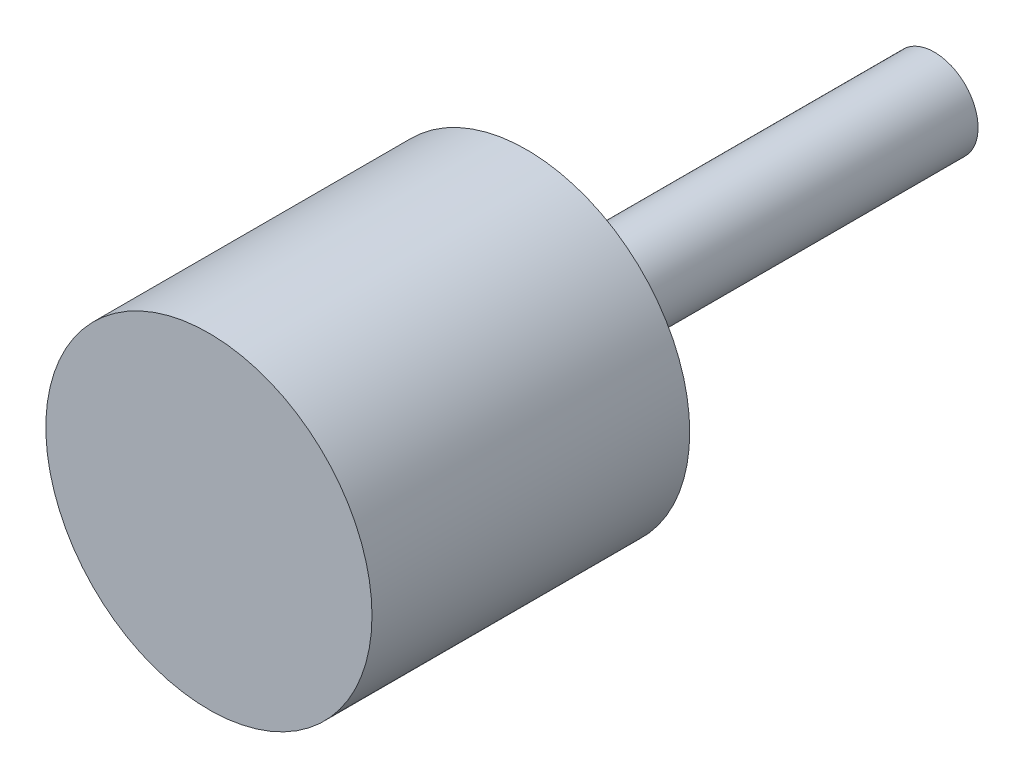
ISO-10303-21;
HEADER;
FILE_DESCRIPTION(('STEP AP214'),'2;1');
FILE_NAME('part.step','',(''),(''),'','','');
FILE_SCHEMA(('AUTOMOTIVE_DESIGN { 1 0 10303 214 1 1 1 1 }'));
ENDSEC;
DATA;
#1=APPLICATION_CONTEXT('core data for automotive mechanical design processes');
#2=APPLICATION_PROTOCOL_DEFINITION('international standard','automotive_design',2000,#1);
#3=PRODUCT_CONTEXT('',#1,'mechanical');
#4=PRODUCT('Part','Part','',(#3));
#5=PRODUCT_RELATED_PRODUCT_CATEGORY('part','',(#4));
#6=PRODUCT_DEFINITION_FORMATION('','',#4);
#7=PRODUCT_DEFINITION_CONTEXT('part definition',#1,'design');
#8=PRODUCT_DEFINITION('design','',#6,#7);
#9=PRODUCT_DEFINITION_SHAPE('','',#8);
#10=(LENGTH_UNIT() NAMED_UNIT(*) SI_UNIT(.MILLI.,.METRE.));
#11=(NAMED_UNIT(*) PLANE_ANGLE_UNIT() SI_UNIT($,.RADIAN.));
#12=(NAMED_UNIT(*) SI_UNIT($,.STERADIAN.) SOLID_ANGLE_UNIT());
#13=UNCERTAINTY_MEASURE_WITH_UNIT(LENGTH_MEASURE(1.E-05),#10,'distance_accuracy_value','');
#14=(GEOMETRIC_REPRESENTATION_CONTEXT(3) GLOBAL_UNCERTAINTY_ASSIGNED_CONTEXT((#13)) GLOBAL_UNIT_ASSIGNED_CONTEXT((#10,
#11,#12)) REPRESENTATION_CONTEXT('',''));
#15=CARTESIAN_POINT('',(0.,0.,0.));
#16=DIRECTION('',(0.,0.,1.));
#17=DIRECTION('',(1.,0.,0.));
#18=AXIS2_PLACEMENT_3D('',#15,#16,#17);
#19=CARTESIAN_POINT('',(0.,0.,29.));
#20=DIRECTION('',(0.,0.,-1.));
#21=DIRECTION('',(-1.,0.,0.));
#22=AXIS2_PLACEMENT_3D('',#19,#20,#21);
#23=CYLINDRICAL_SURFACE('',#22,3.11);
#24=CARTESIAN_POINT('',(0.,0.,29.));
#25=DIRECTION('',(0.,0.,1.));
#26=DIRECTION('',(1.,0.,0.));
#27=AXIS2_PLACEMENT_3D('',#24,#25,#26);
#28=CIRCLE('',#27,3.11);
#29=CARTESIAN_POINT('',(-3.11,0.,29.));
#30=VERTEX_POINT('',#29);
#31=EDGE_CURVE('E10',#30,#30,#28,.T.);
#32=CARTESIAN_POINT('',(0.,0.,0.));
#33=DIRECTION('',(0.,0.,1.));
#34=DIRECTION('',(1.,0.,0.));
#35=AXIS2_PLACEMENT_3D('',#32,#33,#34);
#36=CIRCLE('',#35,3.11);
#37=CARTESIAN_POINT('',(-3.11,0.,0.));
#38=VERTEX_POINT('',#37);
#39=EDGE_CURVE('E33',#38,#38,#36,.T.);
#40=CARTESIAN_POINT('',(-3.11,0.,29.));
#41=CARTESIAN_POINT('',(-3.11,0.,28.6979166666667));
#42=CARTESIAN_POINT('',(-3.11,0.,28.3958333333333));
#43=CARTESIAN_POINT('',(-3.11,0.,27.7916666666667));
#44=CARTESIAN_POINT('',(-3.11,0.,27.4895833333333));
#45=CARTESIAN_POINT('',(-3.11,0.,26.8854166666667));
#46=CARTESIAN_POINT('',(-3.11,0.,26.5833333333333));
#47=CARTESIAN_POINT('',(-3.11,0.,25.9791666666667));
#48=CARTESIAN_POINT('',(-3.11,0.,25.6770833333333));
#49=CARTESIAN_POINT('',(-3.11,0.,25.0729166666667));
#50=CARTESIAN_POINT('',(-3.11,0.,24.7708333333333));
#51=CARTESIAN_POINT('',(-3.11,0.,24.1666666666667));
#52=CARTESIAN_POINT('',(-3.11,0.,23.8645833333333));
#53=CARTESIAN_POINT('',(-3.11,0.,23.2604166666667));
#54=CARTESIAN_POINT('',(-3.11,0.,22.9583333333333));
#55=CARTESIAN_POINT('',(-3.11,0.,22.3541666666667));
#56=CARTESIAN_POINT('',(-3.11,0.,22.0520833333333));
#57=CARTESIAN_POINT('',(-3.11,0.,21.4479166666667));
#58=CARTESIAN_POINT('',(-3.11,0.,21.1458333333333));
#59=CARTESIAN_POINT('',(-3.11,0.,20.5416666666667));
#60=CARTESIAN_POINT('',(-3.11,0.,20.2395833333333));
#61=CARTESIAN_POINT('',(-3.11,0.,19.6354166666667));
#62=CARTESIAN_POINT('',(-3.11,0.,19.3333333333333));
#63=CARTESIAN_POINT('',(-3.11,0.,18.7291666666667));
#64=CARTESIAN_POINT('',(-3.11,0.,18.4270833333333));
#65=CARTESIAN_POINT('',(-3.11,0.,17.8229166666667));
#66=CARTESIAN_POINT('',(-3.11,0.,17.5208333333333));
#67=CARTESIAN_POINT('',(-3.11,0.,16.9166666666667));
#68=CARTESIAN_POINT('',(-3.11,0.,16.6145833333333));
#69=CARTESIAN_POINT('',(-3.11,0.,16.0104166666667));
#70=CARTESIAN_POINT('',(-3.11,0.,15.7083333333333));
#71=CARTESIAN_POINT('',(-3.11,0.,15.1041666666667));
#72=CARTESIAN_POINT('',(-3.11,0.,14.8020833333333));
#73=CARTESIAN_POINT('',(-3.11,0.,14.1979166666667));
#74=CARTESIAN_POINT('',(-3.11,0.,13.8958333333333));
#75=CARTESIAN_POINT('',(-3.11,0.,13.2916666666667));
#76=CARTESIAN_POINT('',(-3.11,0.,12.9895833333333));
#77=CARTESIAN_POINT('',(-3.11,0.,12.3854166666667));
#78=CARTESIAN_POINT('',(-3.11,0.,12.0833333333333));
#79=CARTESIAN_POINT('',(-3.11,0.,11.4791666666667));
#80=CARTESIAN_POINT('',(-3.11,0.,11.1770833333333));
#81=CARTESIAN_POINT('',(-3.11,0.,10.5729166666667));
#82=CARTESIAN_POINT('',(-3.11,0.,10.2708333333333));
#83=CARTESIAN_POINT('',(-3.11,0.,9.66666666666667));
#84=CARTESIAN_POINT('',(-3.11,0.,9.36458333333333));
#85=CARTESIAN_POINT('',(-3.11,0.,8.76041666666667));
#86=CARTESIAN_POINT('',(-3.11,0.,8.45833333333333));
#87=CARTESIAN_POINT('',(-3.11,0.,7.85416666666667));
#88=CARTESIAN_POINT('',(-3.11,0.,7.55208333333333));
#89=CARTESIAN_POINT('',(-3.11,0.,6.94791666666667));
#90=CARTESIAN_POINT('',(-3.11,0.,6.64583333333333));
#91=CARTESIAN_POINT('',(-3.11,0.,6.04166666666667));
#92=CARTESIAN_POINT('',(-3.11,0.,5.73958333333333));
#93=CARTESIAN_POINT('',(-3.11,0.,5.13541666666667));
#94=CARTESIAN_POINT('',(-3.11,0.,4.83333333333333));
#95=CARTESIAN_POINT('',(-3.11,0.,4.22916666666667));
#96=CARTESIAN_POINT('',(-3.11,0.,3.92708333333333));
#97=CARTESIAN_POINT('',(-3.11,0.,3.32291666666667));
#98=CARTESIAN_POINT('',(-3.11,0.,3.02083333333333));
#99=CARTESIAN_POINT('',(-3.11,0.,2.41666666666667));
#100=CARTESIAN_POINT('',(-3.11,0.,2.11458333333333));
#101=CARTESIAN_POINT('',(-3.11,0.,1.51041666666667));
#102=CARTESIAN_POINT('',(-3.11,0.,1.20833333333333));
#103=CARTESIAN_POINT('',(-3.11,0.,0.604166666666667));
#104=CARTESIAN_POINT('',(-3.11,0.,0.302083333333333));
#105=CARTESIAN_POINT('',(-3.11,0.,0.));
#106=B_SPLINE_CURVE_WITH_KNOTS('',3,(#40,#41,#42,#43,#44,#45,#46,#47,#48,#49,#50,#51,#52,#53,
#54,#55,#56,#57,#58,#59,#60,#61,#62,#63,#64,#65,#66,#67,#68,#69,#70,#71,#72,#73,#74,#75,#76,#77,
#78,#79,#80,#81,#82,#83,#84,#85,#86,#87,#88,#89,#90,#91,#92,#93,#94,#95,#96,#97,#98,#99,#100,
#101,#102,#103,#104,#105),.UNSPECIFIED.,.F.,.F.,(4,2,2,2,2,2,2,2,2,2,2,2,2,2,2,2,2,2,2,2,2,2,2,
2,2,2,2,2,2,2,2,2,4),(0.,0.906249999999997,1.8125,2.71875,3.625,4.53125,5.4375,6.34375,7.25,
8.15625,9.0625,9.96875,10.875,11.78125,12.6875,13.59375,14.5,15.40625,16.3125,17.21875,18.125,
19.03125,19.9375,20.84375,21.75,22.65625,23.5625,24.46875,25.375,26.28125,27.1875,28.09375,29.),.UNSPECIFIED.);
#107=EDGE_CURVE('BSEAM27',#30,#38,#106,.T.);
#108=ORIENTED_EDGE('',*,*,#31,.F.);
#109=ORIENTED_EDGE('',*,*,#39,.T.);
#110=ORIENTED_EDGE('',*,*,#107,.T.);
#111=ORIENTED_EDGE('',*,*,#107,.F.);
#112=EDGE_LOOP('',(#108,#110,#109,#111));
#113=FACE_BOUND('',#112,.T.);
#114=ADVANCED_FACE('F27',(#113),#23,.T.);
#115=CARTESIAN_POINT('',(0.,0.,0.));
#116=DIRECTION('',(0.,0.,1.));
#117=DIRECTION('',(1.,0.,0.));
#118=AXIS2_PLACEMENT_3D('',#115,#116,#117);
#119=PLANE('',#118);
#120=ORIENTED_EDGE('',*,*,#39,.F.);
#121=EDGE_LOOP('',(#120));
#122=FACE_BOUND('',#121,.T.);
#123=ADVANCED_FACE('F51',(#122),#119,.F.);
#124=CARTESIAN_POINT('',(0.,0.,29.));
#125=DIRECTION('',(0.,0.,1.));
#126=DIRECTION('',(1.,0.,0.));
#127=AXIS2_PLACEMENT_3D('',#124,#125,#126);
#128=PLANE('',#127);
#129=CARTESIAN_POINT('',(0.,0.,29.));
#130=DIRECTION('',(0.,0.,1.));
#131=DIRECTION('',(1.,0.,0.));
#132=AXIS2_PLACEMENT_3D('',#129,#130,#131);
#133=CIRCLE('',#132,11.6);
#134=CARTESIAN_POINT('',(11.6,0.,29.));
#135=VERTEX_POINT('',#134);
#136=EDGE_CURVE('E41',#135,#135,#133,.T.);
#137=ORIENTED_EDGE('',*,*,#136,.F.);
#138=EDGE_LOOP('',(#137));
#139=FACE_BOUND('',#138,.T.);
#140=ORIENTED_EDGE('',*,*,#31,.T.);
#141=EDGE_LOOP('',(#140));
#142=FACE_BOUND('',#141,.T.);
#143=ADVANCED_FACE('F49',(#139,#142),#128,.F.);
#144=CARTESIAN_POINT('',(0.,0.,51.6));
#145=DIRECTION('',(0.,0.,-1.));
#146=DIRECTION('',(-1.,0.,0.));
#147=AXIS2_PLACEMENT_3D('',#144,#145,#146);
#148=CYLINDRICAL_SURFACE('',#147,11.6);
#149=CARTESIAN_POINT('',(0.,0.,51.6));
#150=DIRECTION('',(0.,0.,1.));
#151=DIRECTION('',(1.,0.,0.));
#152=AXIS2_PLACEMENT_3D('',#149,#150,#151);
#153=CIRCLE('',#152,11.6);
#154=CARTESIAN_POINT('',(11.6,0.,51.6));
#155=VERTEX_POINT('',#154);
#156=EDGE_CURVE('E37',#155,#155,#153,.T.);
#157=ORIENTED_EDGE('',*,*,#156,.F.);
#158=EDGE_LOOP('',(#157));
#159=FACE_BOUND('',#158,.T.);
#160=ORIENTED_EDGE('',*,*,#136,.T.);
#161=EDGE_LOOP('',(#160));
#162=FACE_BOUND('',#161,.T.);
#163=ADVANCED_FACE('F47',(#159,#162),#148,.T.);
#164=CARTESIAN_POINT('',(0.,0.,51.6));
#165=DIRECTION('',(0.,0.,1.));
#166=DIRECTION('',(1.,0.,0.));
#167=AXIS2_PLACEMENT_3D('',#164,#165,#166);
#168=PLANE('',#167);
#169=ORIENTED_EDGE('',*,*,#156,.T.);
#170=EDGE_LOOP('',(#169));
#171=FACE_BOUND('',#170,.T.);
#172=ADVANCED_FACE('F57',(#171),#168,.T.);
#173=CLOSED_SHELL('',(#114,#123,#143,#163,#172));
#174=MANIFOLD_SOLID_BREP('B2',#173);
#175=ADVANCED_BREP_SHAPE_REPRESENTATION('',(#18,#174),#14);
#176=SHAPE_DEFINITION_REPRESENTATION(#9,#175);
ENDSEC;
END-ISO-10303-21;
